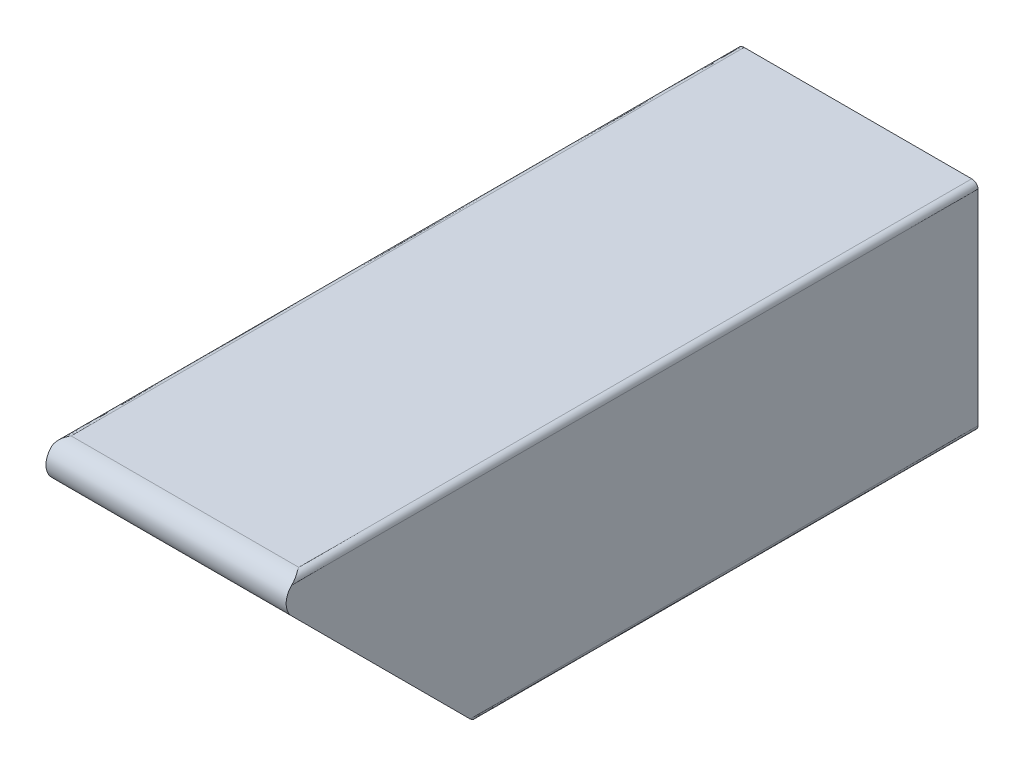
ISO-10303-21;
HEADER;
FILE_DESCRIPTION(('STEP AP214'),'2;1');
FILE_NAME('part.step','',(''),(''),'','','');
FILE_SCHEMA(('AUTOMOTIVE_DESIGN { 1 0 10303 214 1 1 1 1 }'));
ENDSEC;
DATA;
#1=APPLICATION_CONTEXT('core data for automotive mechanical design processes');
#2=APPLICATION_PROTOCOL_DEFINITION('international standard','automotive_design',2000,#1);
#3=PRODUCT_CONTEXT('',#1,'mechanical');
#4=PRODUCT('Part','Part','',(#3));
#5=PRODUCT_RELATED_PRODUCT_CATEGORY('part','',(#4));
#6=PRODUCT_DEFINITION_FORMATION('','',#4);
#7=PRODUCT_DEFINITION_CONTEXT('part definition',#1,'design');
#8=PRODUCT_DEFINITION('design','',#6,#7);
#9=PRODUCT_DEFINITION_SHAPE('','',#8);
#10=(LENGTH_UNIT() NAMED_UNIT(*) SI_UNIT(.MILLI.,.METRE.));
#11=(NAMED_UNIT(*) PLANE_ANGLE_UNIT() SI_UNIT($,.RADIAN.));
#12=(NAMED_UNIT(*) SI_UNIT($,.STERADIAN.) SOLID_ANGLE_UNIT());
#13=UNCERTAINTY_MEASURE_WITH_UNIT(LENGTH_MEASURE(1.E-05),#10,'distance_accuracy_value','');
#14=(GEOMETRIC_REPRESENTATION_CONTEXT(3) GLOBAL_UNCERTAINTY_ASSIGNED_CONTEXT((#13)) GLOBAL_UNIT_ASSIGNED_CONTEXT((#10,
#11,#12)) REPRESENTATION_CONTEXT('',''));
#15=CARTESIAN_POINT('',(0.,0.,0.));
#16=DIRECTION('',(0.,0.,1.));
#17=DIRECTION('',(1.,0.,0.));
#18=AXIS2_PLACEMENT_3D('',#15,#16,#17);
#19=CARTESIAN_POINT('',(-2.84195847499171,5.57,0.));
#20=CARTESIAN_POINT('',(-2.84195847499171,5.87,0.));
#21=CARTESIAN_POINT('',(-3.17500043299171,5.87,0.));
#22=CARTESIAN_POINT('',(-3.17500043299171,5.57,0.));
#23=CARTESIAN_POINT('',(-3.17500043299171,5.27,0.));
#24=CARTESIAN_POINT('',(-2.84195847499171,5.27,0.));
#25=CARTESIAN_POINT('',(-2.84195847499171,5.57,0.));
#26=(BOUNDED_CURVE() B_SPLINE_CURVE(3,(#19,#20,#21,#22,#23,#24,#25),.UNSPECIFIED.,.T.,
.F.) B_SPLINE_CURVE_WITH_KNOTS((4,3,4),(0.,0.5,1.),
.UNSPECIFIED.) CURVE() GEOMETRIC_REPRESENTATION_ITEM() RATIONAL_B_SPLINE_CURVE((1.,
0.333333333333333,0.333333333333333,1.,0.333333333333333,0.333333333333333,1.)) REPRESENTATION_ITEM(''));
#27=DIRECTION('',(0.,0.,1.));
#28=VECTOR('',#27,1.);
#29=SURFACE_OF_LINEAR_EXTRUSION('',#26,#28);
#30=DIRECTION('',(0.,0.,1.));
#31=VECTOR('',#30,1.);
#32=CARTESIAN_POINT('',(-3.00847945399171,5.72,0.));
#33=LINE('',#32,#31);
#34=CARTESIAN_POINT('',(-3.00847945399171,5.72,0.));
#35=VERTEX_POINT('',#34);
#36=CARTESIAN_POINT('',(-3.00847945399171,5.72,17.79289321881));
#37=VERTEX_POINT('',#36);
#38=EDGE_CURVE('E137',#35,#37,#33,.T.);
#39=ORIENTED_EDGE('',*,*,#38,.F.);
#40=CARTESIAN_POINT('',(-3.00847945399171,5.72,0.));
#41=CARTESIAN_POINT('',(-3.10602518507026,5.72,0.));
#42=CARTESIAN_POINT('',(-3.17500043299171,5.65786796564404,0.));
#43=CARTESIAN_POINT('',(-3.17500043299171,5.57,0.));
#44=(BOUNDED_CURVE() B_SPLINE_CURVE(3,(#40,#41,#42,#43),.UNSPECIFIED.,.F.,
.F.) B_SPLINE_CURVE_WITH_KNOTS((4,4),(0.,1.),
.UNSPECIFIED.) CURVE() GEOMETRIC_REPRESENTATION_ITEM() RATIONAL_B_SPLINE_CURVE((1.,
0.804737854124365,0.804737854124365,1.)) REPRESENTATION_ITEM(''));
#45=CARTESIAN_POINT('',(-3.17500043299171,5.57,0.));
#46=VERTEX_POINT('',#45);
#47=EDGE_CURVE('E135',#35,#46,#44,.T.);
#48=ORIENTED_EDGE('',*,*,#47,.T.);
#49=DIRECTION('',(0.,0.,1.));
#50=VECTOR('',#49,1.);
#51=CARTESIAN_POINT('',(-3.17500043299171,5.57,0.));
#52=LINE('',#51,#50);
#53=CARTESIAN_POINT('',(-3.17500043299171,5.57,18.14996464024));
#54=VERTEX_POINT('',#53);
#55=EDGE_CURVE('E11',#46,#54,#52,.T.);
#56=ORIENTED_EDGE('',*,*,#55,.T.);
#57=CARTESIAN_POINT('',(-3.17500043299171,5.57,18.14996464024));
#58=CARTESIAN_POINT('',(-3.17499862745097,5.57325314991682,18.146357391879));
#59=CARTESIAN_POINT('',(-3.17488282418564,5.57643203081947,18.142686482399));
#60=CARTESIAN_POINT('',(-3.17441917945536,5.58299635891492,18.1348503921439));
#61=CARTESIAN_POINT('',(-3.17404777046248,5.58636736416267,18.1306744447046));
#62=CARTESIAN_POINT('',(-3.17302752625531,5.59331063955079,18.1218295027796));
#63=CARTESIAN_POINT('',(-3.17235472858941,5.5968694795211,18.1171528522761));
#64=CARTESIAN_POINT('',(-3.1706793366588,5.60417224644487,18.1073028596466));
#65=CARTESIAN_POINT('',(-3.16965190825141,5.60790264778196,18.1021237409312));
#66=CARTESIAN_POINT('',(-3.16721230426873,5.61552443871989,18.0912674580455));
#67=CARTESIAN_POINT('',(-3.16577444686674,5.61940163339095,18.085586136188));
#68=CARTESIAN_POINT('',(-3.16245717589851,5.62728132580953,18.0737239843183));
#69=CARTESIAN_POINT('',(-3.16055130699932,5.63126823565474,18.0675402205765));
#70=CARTESIAN_POINT('',(-3.156242370209,5.63931857058958,18.0546721950702));
#71=CARTESIAN_POINT('',(-3.15381236769728,5.64336437984341,18.0479859486439));
#72=CARTESIAN_POINT('',(-3.14840452386978,5.65146879659182,18.0341124036215));
#73=CARTESIAN_POINT('',(-3.14539978171456,5.6555071970197,18.0269238166874));
#74=CARTESIAN_POINT('',(-3.13880125486425,5.66351786074037,18.0120446192704));
#75=CARTESIAN_POINT('',(-3.13518131050419,5.66746695757818,18.0043531077854));
#76=CARTESIAN_POINT('',(-3.12938243836477,5.67318024093566,17.9926245642263));
#77=CARTESIAN_POINT('',(-3.12733779542265,5.67508966146713,17.9885907415216));
#78=CARTESIAN_POINT('',(-3.12309091142364,5.6788521947167,17.9803973031705));
#79=CARTESIAN_POINT('',(-3.1208857694157,5.68070183341863,17.9762375896874));
#80=CARTESIAN_POINT('',(-3.11631848635312,5.6843309064639,17.9677925787227));
#81=CARTESIAN_POINT('',(-3.11395363696705,5.68610668719423,17.9635071784855));
#82=CARTESIAN_POINT('',(-3.10906921066446,5.68957380764901,17.954810758318));
#83=CARTESIAN_POINT('',(-3.10654714905366,5.69126133646724,17.9503996148654));
#84=CARTESIAN_POINT('',(-3.10135251501738,5.69453741942217,17.9414517498225));
#85=CARTESIAN_POINT('',(-3.09867771433626,5.69612202886507,17.9369148784957));
#86=CARTESIAN_POINT('',(-3.09318384925964,5.69917773390663,17.9277155849567));
#87=CARTESIAN_POINT('',(-3.09036284155328,5.70064478179833,17.9230529795752));
#88=CARTESIAN_POINT('',(-3.08458492430866,5.70345108078538,17.9136022547674));
#89=CARTESIAN_POINT('',(-3.08162638044113,5.70478621669916,17.9088139134154));
#90=CARTESIAN_POINT('',(-3.07558388694593,5.70731496661242,17.8991117544249));
#91=CARTESIAN_POINT('',(-3.07249862991545,5.70850443758609,17.8941976720493));
#92=CARTESIAN_POINT('',(-3.06621530334359,5.71072900038399,17.8842440697854));
#93=CARTESIAN_POINT('',(-3.06301626426597,5.71175996343614,17.8792042400191));
#94=CARTESIAN_POINT('',(-3.05651995853148,5.71365583696204,17.8689991807697));
#95=CARTESIAN_POINT('',(-3.05322206343766,5.71451667582651,17.8638335957328));
#96=CARTESIAN_POINT('',(-3.04654445733593,5.71606210761188,17.8533770597735));
#97=CARTESIAN_POINT('',(-3.04316445453416,5.71674272773716,17.8480857088653));
#98=CARTESIAN_POINT('',(-3.03634060953004,5.71791931443123,17.8373776749917));
#99=CARTESIAN_POINT('',(-3.03289679976672,5.71841144624887,17.8319605506421));
#100=CARTESIAN_POINT('',(-3.02596467693572,5.71920457313592,17.821000981547));
#101=CARTESIAN_POINT('',(-3.02247670331342,5.71950190416096,17.8154580580786));
#102=CARTESIAN_POINT('',(-3.01547623965094,5.71990145491796,17.8042469604541));
#103=CARTESIAN_POINT('',(-3.01196436710373,5.72000021512855,17.7985782768211));
#104=CARTESIAN_POINT('',(-3.00847945399171,5.72,17.79289321881));
#105=B_SPLINE_CURVE_WITH_KNOTS('',3,(#57,#58,#59,#60,#61,#62,#63,#64,#65,#66,#67,#68,#69,#70,
#71,#72,#73,#74,#75,#76,#77,#78,#79,#80,#81,#82,#83,#84,#85,#86,#87,#88,#89,#90,#91,#92,#93,#94,
#95,#96,#97,#98,#99,#100,#101,#102,#103,#104),.UNSPECIFIED.,.F.,.F.,(4,2,2,2,2,2,2,2,2,2,2,2,2,
2,2,2,2,2,2,2,2,2,2,4),(0.,0.0145666421575746,0.0306965033720033,0.0484341069619044,
0.0678197555207784,0.0888905845859748,0.11168063135536,0.136219952069652,0.162532769149774,
0.190634668193024,0.205359836027795,0.220532448091844,0.236150358896638,0.252210173879406,
0.268707159322137,0.285635182046729,0.302986687795451,0.320752726285511,0.338923029134572,
0.357486144191566,0.376429626388329,0.395740281285958,0.4154044533678,0.435408347247618),.UNSPECIFIED.);
#106=EDGE_CURVE('E112',#54,#37,#105,.T.);
#107=ORIENTED_EDGE('',*,*,#106,.T.);
#108=EDGE_LOOP('',(#39,#48,#56,#107));
#109=FACE_BOUND('',#108,.T.);
#110=ADVANCED_FACE('F44',(#109),#29,.T.);
#111=CARTESIAN_POINT('',(-3.17500043299171,5.57,0.));
#112=DIRECTION('',(-1.,0.,0.));
#113=DIRECTION('',(0.,0.,1.));
#114=AXIS2_PLACEMENT_3D('',#111,#112,#113);
#115=PLANE('',#114);
#116=ORIENTED_EDGE('',*,*,#55,.F.);
#117=DIRECTION('',(0.,-1.,0.));
#118=VECTOR('',#117,1.);
#119=CARTESIAN_POINT('',(-3.17500043299171,5.57,0.));
#120=LINE('',#119,#118);
#121=CARTESIAN_POINT('',(-3.17500043299171,0.15,0.));
#122=VERTEX_POINT('',#121);
#123=EDGE_CURVE('E130',#46,#122,#120,.T.);
#124=ORIENTED_EDGE('',*,*,#123,.T.);
#125=DIRECTION('',(0.,0.,1.));
#126=VECTOR('',#125,1.);
#127=CARTESIAN_POINT('',(-3.17500043299171,0.15,0.));
#128=LINE('',#127,#126);
#129=CARTESIAN_POINT('',(-3.17495370218495,0.1464466094067,13.42644660941));
#130=VERTEX_POINT('',#129);
#131=EDGE_CURVE('E122',#122,#130,#128,.T.);
#132=ORIENTED_EDGE('',*,*,#131,.T.);
#133=DIRECTION('',(0.,-0.707106781186548,-0.707106781186548));
#134=VECTOR('',#133,1.);
#135=CARTESIAN_POINT('',(-3.17500043299171,4.866446609407,18.14644660941));
#136=LINE('',#135,#134);
#137=CARTESIAN_POINT('',(-3.17500043299171,4.866446609407,18.14644660941));
#138=VERTEX_POINT('',#137);
#139=EDGE_CURVE('E64',#138,#130,#136,.T.);
#140=ORIENTED_EDGE('',*,*,#139,.F.);
#141=CARTESIAN_POINT('',(-3.17500043299171,5.22,17.79289321881));
#142=DIRECTION('',(1.,0.,0.));
#143=DIRECTION('',(0.,0.,-1.));
#144=AXIS2_PLACEMENT_3D('',#141,#142,#143);
#145=CIRCLE('',#144,0.500000000000003);
#146=EDGE_CURVE('E133',#54,#138,#145,.T.);
#147=ORIENTED_EDGE('',*,*,#146,.F.);
#148=EDGE_LOOP('',(#116,#124,#132,#140,#147));
#149=FACE_BOUND('',#148,.T.);
#150=ADVANCED_FACE('F128',(#149),#115,.T.);
#151=CARTESIAN_POINT('',(-3.00847945399171,0.,0.));
#152=DIRECTION('',(0.,-1.,0.));
#153=DIRECTION('',(0.,0.,-1.));
#154=AXIS2_PLACEMENT_3D('',#151,#152,#153);
#155=PLANE('',#154);
#156=DIRECTION('',(0.,0.,1.));
#157=VECTOR('',#156,1.);
#158=CARTESIAN_POINT('',(-3.00847945399171,0.,0.));
#159=LINE('',#158,#157);
#160=CARTESIAN_POINT('',(-3.00847945399171,0.,0.));
#161=VERTEX_POINT('',#160);
#162=CARTESIAN_POINT('',(-3.00847945399171,0.,13.07289321881));
#163=VERTEX_POINT('',#162);
#164=EDGE_CURVE('E55',#161,#163,#159,.T.);
#165=ORIENTED_EDGE('',*,*,#164,.F.);
#166=DIRECTION('',(1.,0.,0.));
#167=VECTOR('',#166,1.);
#168=CARTESIAN_POINT('',(-3.00847945399171,0.,0.));
#169=LINE('',#168,#167);
#170=CARTESIAN_POINT('',(3.00847858720829,0.,0.));
#171=VERTEX_POINT('',#170);
#172=EDGE_CURVE('E153',#161,#171,#169,.T.);
#173=ORIENTED_EDGE('',*,*,#172,.T.);
#174=DIRECTION('',(0.,0.,1.));
#175=VECTOR('',#174,1.);
#176=CARTESIAN_POINT('',(3.00847858720829,0.,0.));
#177=LINE('',#176,#175);
#178=CARTESIAN_POINT('',(3.00847858720829,0.,13.07289321881));
#179=VERTEX_POINT('',#178);
#180=EDGE_CURVE('E337',#171,#179,#177,.T.);
#181=ORIENTED_EDGE('',*,*,#180,.T.);
#182=DIRECTION('',(1.,0.,0.));
#183=VECTOR('',#182,1.);
#184=CARTESIAN_POINT('',(-3.00847945399171,0.,13.07289321881));
#185=LINE('',#184,#183);
#186=EDGE_CURVE('E358',#163,#179,#185,.T.);
#187=ORIENTED_EDGE('',*,*,#186,.F.);
#188=EDGE_LOOP('',(#165,#173,#181,#187));
#189=FACE_BOUND('',#188,.T.);
#190=ADVANCED_FACE('F187',(#189),#155,.T.);
#191=CARTESIAN_POINT('',(-2.84195847499171,0.15,0.));
#192=CARTESIAN_POINT('',(-2.84195847499171,0.45,0.));
#193=CARTESIAN_POINT('',(-3.17500043299171,0.45,0.));
#194=CARTESIAN_POINT('',(-3.17500043299171,0.15,0.));
#195=CARTESIAN_POINT('',(-3.17500043299171,-0.15,0.));
#196=CARTESIAN_POINT('',(-2.84195847499171,-0.15,0.));
#197=CARTESIAN_POINT('',(-2.84195847499171,0.15,0.));
#198=(BOUNDED_CURVE() B_SPLINE_CURVE(3,(#191,#192,#193,#194,#195,#196,#197),.UNSPECIFIED.,.T.,
.F.) B_SPLINE_CURVE_WITH_KNOTS((4,3,4),(0.,0.5,1.),
.UNSPECIFIED.) CURVE() GEOMETRIC_REPRESENTATION_ITEM() RATIONAL_B_SPLINE_CURVE((1.,
0.333333333333333,0.333333333333333,1.,0.333333333333333,0.333333333333333,1.)) REPRESENTATION_ITEM(''));
#199=DIRECTION('',(0.,0.,1.));
#200=VECTOR('',#199,1.);
#201=SURFACE_OF_LINEAR_EXTRUSION('',#198,#200);
#202=CARTESIAN_POINT('',(-3.00847945399171,0.,13.07289321881));
#203=CARTESIAN_POINT('',(-3.01194944272304,-2.12078318790988E-07,13.0785429327722));
#204=CARTESIAN_POINT('',(-3.0154449096805,9.77023975147779E-05,13.0841771395099));
#205=CARTESIAN_POINT('',(-3.02240868938693,0.000493299438635442,13.0953191611006));
#206=CARTESIAN_POINT('',(-3.02587641479141,0.000787473084814518,13.1008274682234));
#207=CARTESIAN_POINT('',(-3.03276461086166,0.00157138969136472,13.1117176899731));
#208=CARTESIAN_POINT('',(-3.03618477529502,0.00205743025301691,13.1171000637268));
#209=CARTESIAN_POINT('',(-3.04295848459725,0.00321839887637884,13.1277384815051));
#210=CARTESIAN_POINT('',(-3.04631203057034,0.00388946673736666,13.1329949454903));
#211=CARTESIAN_POINT('',(-3.05293455080314,0.00541192432341553,13.1433815936664));
#212=CARTESIAN_POINT('',(-3.05620384802753,0.00625932983615945,13.1485121551572));
#213=CARTESIAN_POINT('',(-3.06264152681588,0.00812415322956434,13.1586470529941));
#214=CARTESIAN_POINT('',(-3.06581056264199,0.00913750248981244,13.1636517216323));
#215=CARTESIAN_POINT('',(-3.07203322949912,0.0113224674342699,13.1735348867776));
#216=CARTESIAN_POINT('',(-3.07508784766353,0.0124899712987167,13.1784136700178));
#217=CARTESIAN_POINT('',(-3.08106919574608,0.0149703565190709,13.1880451131257));
#218=CARTESIAN_POINT('',(-3.0839972398401,0.0162791245822433,13.1927980154157));
#219=CARTESIAN_POINT('',(-3.08971505834387,0.019028322263456,13.2021777467308));
#220=CARTESIAN_POINT('',(-3.09250646081873,0.0204646772870443,13.2068047766669));
#221=CARTESIAN_POINT('',(-3.09794273243064,0.023454798105024,13.2159327859545));
#222=CARTESIAN_POINT('',(-3.10058952421611,0.0250045655237463,13.2204339297588));
#223=CARTESIAN_POINT('',(-3.10573044021112,0.0282070675966754,13.2293102593447));
#224=CARTESIAN_POINT('',(-3.10822675587899,0.0298559119917289,13.2336855769395));
#225=CARTESIAN_POINT('',(-3.11306248335464,0.0332420210716107,13.2423100626449));
#226=CARTESIAN_POINT('',(-3.11540432964893,0.0349755350881934,13.2465593443616));
#227=CARTESIAN_POINT('',(-3.12209141247752,0.0402096118181162,13.2589336993872));
#228=CARTESIAN_POINT('',(-3.12631363265064,0.043878473417415,13.2670552647253));
#229=CARTESIAN_POINT('',(-3.13411137328998,0.05142002934569,13.2827942205449));
#230=CARTESIAN_POINT('',(-3.13771058898799,0.0552668462640475,13.2904123003478));
#231=CARTESIAN_POINT('',(-3.14428590354577,0.06306830714555,13.3051447438512));
#232=CARTESIAN_POINT('',(-3.1472872030439,0.0670000560989954,13.3122599544713));
#233=CARTESIAN_POINT('',(-3.15270592044309,0.0748900453355242,13.32598599026));
#234=CARTESIAN_POINT('',(-3.15514919373993,0.0788282093349038,13.3325981348134));
#235=CARTESIAN_POINT('',(-3.15950150367055,0.0866655720940462,13.3453173821924));
#236=CARTESIAN_POINT('',(-3.16143636069962,0.0905470991325357,13.3514265183213));
#237=CARTESIAN_POINT('',(-3.16482667189701,0.0982210251959855,13.3631387668998));
#238=CARTESIAN_POINT('',(-3.16630745177044,0.101997596441557,13.368744897021));
#239=CARTESIAN_POINT('',(-3.16884584468519,0.109425145843874,13.3794501419823));
#240=CARTESIAN_POINT('',(-3.16992802289472,0.113061508205031,13.3845535343679));
#241=CARTESIAN_POINT('',(-3.1717235992312,0.120184593842644,13.3942513558615));
#242=CARTESIAN_POINT('',(-3.17246074657529,0.123657192478676,13.3988517342334));
#243=CARTESIAN_POINT('',(-3.1736181526168,0.130437126039481,13.4075434424189));
#244=CARTESIAN_POINT('',(-3.17406132812569,0.133730267214624,13.4116426628685));
#245=CARTESIAN_POINT('',(-3.17467496722192,0.1401486453217,13.4193242848978));
#246=CARTESIAN_POINT('',(-3.17486799153346,0.143258474093112,13.4229178239839));
#247=CARTESIAN_POINT('',(-3.17495370218474,0.146446609406705,13.42644660941));
#248=B_SPLINE_CURVE_WITH_KNOTS('',3,(#202,#203,#204,#205,#206,#207,#208,#209,#210,#211,#212,
#213,#214,#215,#216,#217,#218,#219,#220,#221,#222,#223,#224,#225,#226,#227,#228,#229,#230,#231,
#232,#233,#234,#235,#236,#237,#238,#239,#240,#241,#242,#243,#244,#245,#246,#247),.UNSPECIFIED.,
.F.,.F.,(4,2,2,2,2,2,2,2,2,2,2,2,2,2,2,2,2,2,2,2,2,2,4),(0.,0.0198901049183658,
0.0394337980003904,0.0586174773289835,0.0774278062092118,0.0958520167549782,0.113878176277606,
0.13149540645306,0.148694049160093,0.16546577684869,0.181803648939331,0.197702118782506,
0.213156997949304,0.242722325792192,0.270493635771057,0.296476620079555,0.320688392987399,
0.343154088617531,0.363904259387206,0.38297320754423,0.400398262263754,0.416219993603022,
0.430483420981324),.UNSPECIFIED.);
#249=EDGE_CURVE('E168',#163,#130,#248,.T.);
#250=ORIENTED_EDGE('',*,*,#249,.T.);
#251=ORIENTED_EDGE('',*,*,#131,.F.);
#252=CARTESIAN_POINT('',(-3.17500043299171,0.15,0.));
#253=CARTESIAN_POINT('',(-3.17500043299171,0.0621320343559642,0.));
#254=CARTESIAN_POINT('',(-3.10602518507026,0.,0.));
#255=CARTESIAN_POINT('',(-3.00847945399171,0.,0.));
#256=(BOUNDED_CURVE() B_SPLINE_CURVE(3,(#252,#253,#254,#255),.UNSPECIFIED.,.F.,
.F.) B_SPLINE_CURVE_WITH_KNOTS((4,4),(0.,1.),
.UNSPECIFIED.) CURVE() GEOMETRIC_REPRESENTATION_ITEM() RATIONAL_B_SPLINE_CURVE((1.,
0.804737854124365,0.804737854124365,1.)) REPRESENTATION_ITEM(''));
#257=EDGE_CURVE('E146',#122,#161,#256,.T.);
#258=ORIENTED_EDGE('',*,*,#257,.T.);
#259=ORIENTED_EDGE('',*,*,#164,.T.);
#260=EDGE_LOOP('',(#250,#251,#258,#259));
#261=FACE_BOUND('',#260,.T.);
#262=ADVANCED_FACE('F177',(#261),#201,.T.);
#263=CARTESIAN_POINT('',(-4.82910882439171,0.,13.28));
#264=DIRECTION('',(0.,0.707106781186548,-0.707106781186548));
#265=DIRECTION('',(-1.,0.,0.));
#266=AXIS2_PLACEMENT_3D('',#263,#264,#265);
#267=PLANE('',#266);
#268=ORIENTED_EDGE('',*,*,#139,.T.);
#269=DIRECTION('',(1.,0.,0.));
#270=VECTOR('',#269,1.);
#271=CARTESIAN_POINT('',(-3.17495370218495,0.1464466094067,13.42644660941));
#272=LINE('',#271,#270);
#273=CARTESIAN_POINT('',(3.17495283540153,0.1464466094067,13.42644660941));
#274=VERTEX_POINT('',#273);
#275=EDGE_CURVE('E325',#130,#274,#272,.T.);
#276=ORIENTED_EDGE('',*,*,#275,.T.);
#277=DIRECTION('',(0.,0.707106781186548,0.707106781186548));
#278=VECTOR('',#277,1.);
#279=CARTESIAN_POINT('',(3.17499956620829,0.15,13.43));
#280=LINE('',#279,#278);
#281=CARTESIAN_POINT('',(3.17499956620829,4.866446609407,18.14644660941));
#282=VERTEX_POINT('',#281);
#283=EDGE_CURVE('E314',#274,#282,#280,.T.);
#284=ORIENTED_EDGE('',*,*,#283,.T.);
#285=DIRECTION('',(-1.,0.,0.));
#286=VECTOR('',#285,1.);
#287=CARTESIAN_POINT('',(3.17499956620829,4.866446609407,18.14644660941));
#288=LINE('',#287,#286);
#289=EDGE_CURVE('E211',#282,#138,#288,.T.);
#290=ORIENTED_EDGE('',*,*,#289,.T.);
#291=EDGE_LOOP('',(#268,#276,#284,#290));
#292=FACE_BOUND('',#291,.T.);
#293=ADVANCED_FACE('F186',(#292),#267,.F.);
#294=CARTESIAN_POINT('',(3.17499956620829,0.5,13.07289321881));
#295=DIRECTION('',(1.,0.,0.));
#296=DIRECTION('',(0.,1.,0.));
#297=AXIS2_PLACEMENT_3D('',#294,#295,#296);
#298=CYLINDRICAL_SURFACE('',#297,0.5);
#299=ORIENTED_EDGE('',*,*,#249,.F.);
#300=ORIENTED_EDGE('',*,*,#186,.T.);
#301=CARTESIAN_POINT('',(3.17495283540132,0.146446609406704,13.42644660941));
#302=CARTESIAN_POINT('',(3.17486712208981,0.14325835320795,13.422917462407));
#303=CARTESIAN_POINT('',(3.17467408514818,0.140148387828344,13.4193235789311));
#304=CARTESIAN_POINT('',(3.17406040092783,0.13372974513118,13.4116413107918));
#305=CARTESIAN_POINT('',(3.17361719369499,0.130436471314702,13.4075417930211));
#306=CARTESIAN_POINT('',(3.17245970344919,0.123656285501075,13.3988495322882));
#307=CARTESIAN_POINT('',(3.17172250421772,0.120183563739687,13.3942489015938));
#308=CARTESIAN_POINT('',(3.16992680411833,0.113060248489168,13.3845506192397));
#309=CARTESIAN_POINT('',(3.16884455468367,0.109423776872173,13.3794470204691));
#310=CARTESIAN_POINT('',(3.16630600123485,0.101996030399014,13.3687414070513));
#311=CARTESIAN_POINT('',(3.164825132839,0.0982193692276463,13.3631351163665));
#312=CARTESIAN_POINT('',(3.16143463028969,0.0905452897504479,13.3514225915978));
#313=CARTESIAN_POINT('',(3.159499671476,0.0866636975805369,13.3453133408878));
#314=CARTESIAN_POINT('',(3.15514714960205,0.0788262359014477,13.3325939096923));
#315=CARTESIAN_POINT('',(3.1527037675475,0.0748880367621258,13.3259816965743));
#316=CARTESIAN_POINT('',(3.14728483262103,0.0669980126059757,13.3122555693469));
#317=CARTESIAN_POINT('',(3.14428342618825,0.0630662626104399,13.3051403362199));
#318=CARTESIAN_POINT('',(3.13770790849706,0.055264837228335,13.2904078936589));
#319=CARTESIAN_POINT('',(3.13410859890058,0.0514180554553656,13.2827898374192));
#320=CARTESIAN_POINT('',(3.12631069387665,0.0438766068022424,13.2670509748763));
#321=CARTESIAN_POINT('',(3.1220884059496,0.0402078155732511,13.2589294791663));
#322=CARTESIAN_POINT('',(3.11540124094486,0.0349738595278556,13.2465552439168));
#323=CARTESIAN_POINT('',(3.1130593751044,0.0332403923808958,13.2423060141511));
#324=CARTESIAN_POINT('',(3.10822361980861,0.0298543838635118,13.2336816439158));
#325=CARTESIAN_POINT('',(3.10572729625465,0.0282055928240251,13.2293063898059));
#326=CARTESIAN_POINT('',(3.10058637733051,0.0250032029801756,13.220430198754));
#327=CARTESIAN_POINT('',(3.0979395908904,0.0234534940500726,13.2159291299603));
#328=CARTESIAN_POINT('',(3.09250334420008,0.0204634941205772,13.20680128226));
#329=CARTESIAN_POINT('',(3.08971196168103,0.0190272010631306,13.2021743388612));
#330=CARTESIAN_POINT('',(3.08399419845866,0.0162781293428696,13.1927947921833));
#331=CARTESIAN_POINT('',(3.08106619005072,0.0149694247926938,13.1880419879557));
#332=CARTESIAN_POINT('',(3.07508492952798,0.0124891664994015,13.1784107525296));
#333=CARTESIAN_POINT('',(3.0720303635683,0.0113217255223476,13.173532078876));
#334=CARTESIAN_POINT('',(3.06580781774044,0.00913688393022673,13.1636491444533));
#335=CARTESIAN_POINT('',(3.06263885103041,0.00812359456903562,13.1586445969252));
#336=CARTESIAN_POINT('',(3.05620132708543,0.00625888609579583,13.1485099528487));
#337=CARTESIAN_POINT('',(3.05293211583154,0.00541153500698445,13.1433795239914));
#338=CARTESIAN_POINT('',(3.04630978366173,0.00388917887925133,13.1329931526118));
#339=CARTESIAN_POINT('',(3.04295633996883,0.00321815743395608,13.1277368327837));
#340=CARTESIAN_POINT('',(3.03618285035783,0.0020572717762206,13.1170987148385));
#341=CARTESIAN_POINT('',(3.03276280346275,0.00157126713555015,13.1117164967666));
#342=CARTESIAN_POINT('',(3.02587485610889,0.000787410139553582,13.1008265978881));
#343=CARTESIAN_POINT('',(3.02240726194668,0.000493259555085415,13.0953184579727));
#344=CARTESIAN_POINT('',(3.01544375639667,9.76943125874671E-05,13.0841767822972));
#345=CARTESIAN_POINT('',(3.0119484323549,-2.12039898597423E-07,13.0785427542974));
#346=CARTESIAN_POINT('',(3.00847858720829,0.,13.07289321881));
#347=B_SPLINE_CURVE_WITH_KNOTS('',3,(#301,#302,#303,#304,#305,#306,#307,#308,#309,#310,#311,
#312,#313,#314,#315,#316,#317,#318,#319,#320,#321,#322,#323,#324,#325,#326,#327,#328,#329,#330,
#331,#332,#333,#334,#335,#336,#337,#338,#339,#340,#341,#342,#343,#344,#345,#346),.UNSPECIFIED.,
.F.,.F.,(4,2,2,2,2,2,2,2,2,2,2,2,2,2,2,2,2,2,2,2,2,2,4),(0.,0.0142644774724175,
0.0300871590480496,0.0475130533583094,0.0665827219426245,0.087333486486415,0.10979964190131,
0.13401173279146,0.15999488457957,0.187766201808264,0.217331366145827,0.232786096152422,
0.248684370194425,0.265021998696404,0.281793434031346,0.298991734867295,0.316608573181338,
0.334634290707503,0.353058009343443,0.371867797012135,0.391050886834225,0.410593943500989,
0.430483366823745),.UNSPECIFIED.);
#348=EDGE_CURVE('E345',#274,#179,#347,.T.);
#349=ORIENTED_EDGE('',*,*,#348,.F.);
#350=ORIENTED_EDGE('',*,*,#275,.F.);
#351=EDGE_LOOP('',(#299,#300,#349,#350));
#352=FACE_BOUND('',#351,.T.);
#353=ADVANCED_FACE('F191',(#352),#298,.T.);
#354=CARTESIAN_POINT('',(3.17499956620829,0.15,0.));
#355=CARTESIAN_POINT('',(3.17499956620829,0.45,0.));
#356=CARTESIAN_POINT('',(2.84195760820829,0.45,0.));
#357=CARTESIAN_POINT('',(2.84195760820829,0.15,0.));
#358=CARTESIAN_POINT('',(2.84195760820829,-0.15,0.));
#359=CARTESIAN_POINT('',(3.17499956620829,-0.15,0.));
#360=CARTESIAN_POINT('',(3.17499956620829,0.15,0.));
#361=(BOUNDED_CURVE() B_SPLINE_CURVE(3,(#354,#355,#356,#357,#358,#359,#360),.UNSPECIFIED.,.T.,
.F.) B_SPLINE_CURVE_WITH_KNOTS((4,3,4),(0.,0.5,1.),
.UNSPECIFIED.) CURVE() GEOMETRIC_REPRESENTATION_ITEM() RATIONAL_B_SPLINE_CURVE((1.,
0.333333333333333,0.333333333333333,1.,0.333333333333333,0.333333333333333,1.)) REPRESENTATION_ITEM(''));
#362=DIRECTION('',(0.,0.,1.));
#363=VECTOR('',#362,1.);
#364=SURFACE_OF_LINEAR_EXTRUSION('',#361,#363);
#365=ORIENTED_EDGE('',*,*,#180,.F.);
#366=CARTESIAN_POINT('',(3.00847858720829,0.,0.));
#367=CARTESIAN_POINT('',(3.10602431828685,0.,0.));
#368=CARTESIAN_POINT('',(3.17499956620829,0.0621320343559642,0.));
#369=CARTESIAN_POINT('',(3.17499956620829,0.15,0.));
#370=(BOUNDED_CURVE() B_SPLINE_CURVE(3,(#366,#367,#368,#369),.UNSPECIFIED.,.F.,
.F.) B_SPLINE_CURVE_WITH_KNOTS((4,4),(0.,1.),
.UNSPECIFIED.) CURVE() GEOMETRIC_REPRESENTATION_ITEM() RATIONAL_B_SPLINE_CURVE((1.,
0.804737854124365,0.804737854124365,1.)) REPRESENTATION_ITEM(''));
#371=CARTESIAN_POINT('',(3.17499956620829,0.15,0.));
#372=VERTEX_POINT('',#371);
#373=EDGE_CURVE('E220',#171,#372,#370,.T.);
#374=ORIENTED_EDGE('',*,*,#373,.T.);
#375=DIRECTION('',(0.,0.,1.));
#376=VECTOR('',#375,1.);
#377=CARTESIAN_POINT('',(3.17499956620829,0.15,0.));
#378=LINE('',#377,#376);
#379=EDGE_CURVE('E333',#372,#274,#378,.T.);
#380=ORIENTED_EDGE('',*,*,#379,.T.);
#381=ORIENTED_EDGE('',*,*,#348,.T.);
#382=EDGE_LOOP('',(#365,#374,#380,#381));
#383=FACE_BOUND('',#382,.T.);
#384=ADVANCED_FACE('F195',(#383),#364,.T.);
#385=CARTESIAN_POINT('',(3.17499956620829,0.15,0.));
#386=DIRECTION('',(1.,0.,0.));
#387=DIRECTION('',(0.,1.,0.));
#388=AXIS2_PLACEMENT_3D('',#385,#386,#387);
#389=PLANE('',#388);
#390=ORIENTED_EDGE('',*,*,#283,.F.);
#391=ORIENTED_EDGE('',*,*,#379,.F.);
#392=DIRECTION('',(0.,1.,0.));
#393=VECTOR('',#392,1.);
#394=CARTESIAN_POINT('',(3.17499956620829,0.15,0.));
#395=LINE('',#394,#393);
#396=CARTESIAN_POINT('',(3.17499956620829,5.57,0.));
#397=VERTEX_POINT('',#396);
#398=EDGE_CURVE('E226',#372,#397,#395,.T.);
#399=ORIENTED_EDGE('',*,*,#398,.T.);
#400=DIRECTION('',(0.,0.,1.));
#401=VECTOR('',#400,1.);
#402=CARTESIAN_POINT('',(3.17499956620829,5.57,0.));
#403=LINE('',#402,#401);
#404=CARTESIAN_POINT('',(3.17499956620829,5.57,18.14996464024));
#405=VERTEX_POINT('',#404);
#406=EDGE_CURVE('E292',#397,#405,#403,.T.);
#407=ORIENTED_EDGE('',*,*,#406,.T.);
#408=CARTESIAN_POINT('',(3.17499956620829,5.22,17.79289321881));
#409=DIRECTION('',(1.,0.,0.));
#410=DIRECTION('',(0.,0.,-1.));
#411=AXIS2_PLACEMENT_3D('',#408,#409,#410);
#412=CIRCLE('',#411,0.500000000000003);
#413=EDGE_CURVE('E219',#405,#282,#412,.T.);
#414=ORIENTED_EDGE('',*,*,#413,.T.);
#415=EDGE_LOOP('',(#390,#391,#399,#407,#414));
#416=FACE_BOUND('',#415,.T.);
#417=ADVANCED_FACE('F260',(#416),#389,.T.);
#418=CARTESIAN_POINT('',(3.17499956620829,5.22,17.79289321881));
#419=DIRECTION('',(1.,0.,0.));
#420=DIRECTION('',(0.,1.,0.));
#421=AXIS2_PLACEMENT_3D('',#418,#419,#420);
#422=CYLINDRICAL_SURFACE('',#421,0.5);
#423=ORIENTED_EDGE('',*,*,#106,.F.);
#424=ORIENTED_EDGE('',*,*,#146,.T.);
#425=ORIENTED_EDGE('',*,*,#289,.F.);
#426=ORIENTED_EDGE('',*,*,#413,.F.);
#427=CARTESIAN_POINT('',(3.00847858720829,5.72,17.79289321881));
#428=CARTESIAN_POINT('',(3.01196482895453,5.7200002154811,17.7985799922239));
#429=CARTESIAN_POINT('',(3.01547802454997,5.71990137976705,17.8042503934334));
#430=CARTESIAN_POINT('',(3.02248102605738,5.71950153310784,17.8154648150752));
#431=CARTESIAN_POINT('',(3.02597021440118,5.71920398744678,17.8210093453182));
#432=CARTESIAN_POINT('',(3.03290463875117,5.71841030542429,17.8319720169812));
#433=CARTESIAN_POINT('',(3.03634953582263,5.71791783902296,17.8373906373487));
#434=CARTESIAN_POINT('',(3.04317541221837,5.71674047919985,17.8481015523987));
#435=CARTESIAN_POINT('',(3.04655636020999,5.71605942647548,17.8533942885774));
#436=CARTESIAN_POINT('',(3.05323570287025,5.71451304877387,17.8638534843395));
#437=CARTESIAN_POINT('',(3.05653439101437,5.71365170246209,17.8690203439108));
#438=CARTESIAN_POINT('',(3.0630321232288,5.71175475719643,17.8792278415951));
#439=CARTESIAN_POINT('',(3.06623179795022,5.71072323553788,17.8842688351632));
#440=CARTESIAN_POINT('',(3.07251623506084,5.70849752228777,17.8942246544818));
#441=CARTESIAN_POINT('',(3.07560196966845,5.70730746487587,17.8991397899253));
#442=CARTESIAN_POINT('',(3.08164526079222,5.70477753142022,17.9088439445639));
#443=CARTESIAN_POINT('',(3.08460412777994,5.70344180345345,17.9136332282446));
#444=CARTESIAN_POINT('',(3.09038254083344,5.70063433056938,17.9230857272569));
#445=CARTESIAN_POINT('',(3.0932037245909,5.69916670547156,17.9277491642194));
#446=CARTESIAN_POINT('',(3.09869780170606,5.69610987487678,17.9369500104747));
#447=CARTESIAN_POINT('',(3.10137264193247,5.69452472127761,17.9414876026238));
#448=CARTESIAN_POINT('',(3.10656722796691,5.69124759492033,17.9504367988482));
#449=CARTESIAN_POINT('',(3.10908920568633,5.68955957058917,17.9548485523543));
#450=CARTESIAN_POINT('',(3.11397335199326,5.68609151723587,17.9635460821176));
#451=CARTESIAN_POINT('',(3.1163380089374,5.68431530240648,17.9678319816244));
#452=CARTESIAN_POINT('',(3.12090481099541,5.68068542962623,17.9762778805643));
#453=CARTESIAN_POINT('',(3.12310966802801,5.67883542815852,17.9804379825346));
#454=CARTESIAN_POINT('',(3.12735590265974,5.67507224520048,17.9886320871704));
#455=CARTESIAN_POINT('',(3.1294001846557,5.67316254022511,17.992666187538));
#456=CARTESIAN_POINT('',(3.13519781981717,5.66744861324996,18.0043952295539));
#457=CARTESIAN_POINT('',(3.13881687471697,5.66349920105003,18.0120869675886));
#458=CARTESIAN_POINT('',(3.14541348607704,5.65548823214192,18.0269661739274));
#459=CARTESIAN_POINT('',(3.14841722429035,5.65144985580645,18.0341545448053));
#460=CARTESIAN_POINT('',(3.1538230339242,5.64334579210969,18.0480272111335));
#461=CARTESIAN_POINT('',(3.15625202397658,5.63930032449326,18.0547127988796));
#462=CARTESIAN_POINT('',(3.16055899599973,5.63125093599896,18.0675790579727));
#463=CARTESIAN_POINT('',(3.16246392643954,5.62726464446946,18.073761720844));
#464=CARTESIAN_POINT('',(3.1657794418973,5.61938639811021,18.0856212186758));
#465=CARTESIAN_POINT('',(3.16721649293033,5.61551004743988,18.0913009977828));
#466=CARTESIAN_POINT('',(3.16965464407169,5.60789009643709,18.1021537399892));
#467=CARTESIAN_POINT('',(3.17068143449978,5.604160711652,18.1073308755697));
#468=CARTESIAN_POINT('',(3.17235572841659,5.59686007122493,18.1171764396387));
#469=CARTESIAN_POINT('',(3.1730280735637,5.59330236788862,18.1218506655659));
#470=CARTESIAN_POINT('',(3.17404759661752,5.58636141051395,18.1306902976313));
#471=CARTESIAN_POINT('',(3.1744187442857,5.58299162019224,18.1348633876701));
#472=CARTESIAN_POINT('',(3.17488203527939,5.57642970469762,18.1426932695076));
#473=CARTESIAN_POINT('',(3.17499775554976,5.57325206536441,18.1463608696201));
#474=CARTESIAN_POINT('',(3.17499956620829,5.57,18.14996464024));
#475=B_SPLINE_CURVE_WITH_KNOTS('',3,(#427,#428,#429,#430,#431,#432,#433,#434,#435,#436,#437,
#438,#439,#440,#441,#442,#443,#444,#445,#446,#447,#448,#449,#450,#451,#452,#453,#454,#455,#456,
#457,#458,#459,#460,#461,#462,#463,#464,#465,#466,#467,#468,#469,#470,#471,#472,#473,#474),
.UNSPECIFIED.,.F.,.F.,(4,2,2,2,2,2,2,2,2,2,2,2,2,2,2,2,2,2,2,2,2,2,2,4),(0.,0.0200103637171067,
0.0396805764022377,0.0589968265029223,0.0779454454638872,0.0965132293181644,0.114687727160791,
0.132457484676881,0.149812234796002,0.166743031679247,0.183242328195114,0.199304000461886,
0.214923325694973,0.23009692138451,0.244822654741098,0.27292448268704,0.29923570920565,
0.323772012956781,0.346557699497148,0.367622899635571,0.387001720523379,0.40473136903737,
0.420852228694326,0.435408924775222),.UNSPECIFIED.);
#476=CARTESIAN_POINT('',(3.00847858720829,5.72,17.79289321881));
#477=VERTEX_POINT('',#476);
#478=EDGE_CURVE('E103',#477,#405,#475,.T.);
#479=ORIENTED_EDGE('',*,*,#478,.F.);
#480=DIRECTION('',(1.,0.,0.));
#481=VECTOR('',#480,1.);
#482=CARTESIAN_POINT('',(-3.00847945399171,5.72,17.79289321881));
#483=LINE('',#482,#481);
#484=EDGE_CURVE('E284',#37,#477,#483,.T.);
#485=ORIENTED_EDGE('',*,*,#484,.F.);
#486=EDGE_LOOP('',(#423,#424,#425,#426,#479,#485));
#487=FACE_BOUND('',#486,.T.);
#488=ADVANCED_FACE('F188',(#487),#422,.T.);
#489=CARTESIAN_POINT('',(3.17499956620829,5.57,0.));
#490=CARTESIAN_POINT('',(3.17499956620829,5.87,0.));
#491=CARTESIAN_POINT('',(2.84195760820829,5.87,0.));
#492=CARTESIAN_POINT('',(2.84195760820829,5.57,0.));
#493=CARTESIAN_POINT('',(2.84195760820829,5.27,0.));
#494=CARTESIAN_POINT('',(3.17499956620829,5.27,0.));
#495=CARTESIAN_POINT('',(3.17499956620829,5.57,0.));
#496=(BOUNDED_CURVE() B_SPLINE_CURVE(3,(#489,#490,#491,#492,#493,#494,#495),.UNSPECIFIED.,.T.,
.F.) B_SPLINE_CURVE_WITH_KNOTS((4,3,4),(0.,0.5,1.),
.UNSPECIFIED.) CURVE() GEOMETRIC_REPRESENTATION_ITEM() RATIONAL_B_SPLINE_CURVE((1.,
0.333333333333333,0.333333333333333,1.,0.333333333333333,0.333333333333333,1.)) REPRESENTATION_ITEM(''));
#497=DIRECTION('',(0.,0.,1.));
#498=VECTOR('',#497,1.);
#499=SURFACE_OF_LINEAR_EXTRUSION('',#496,#498);
#500=ORIENTED_EDGE('',*,*,#406,.F.);
#501=CARTESIAN_POINT('',(3.17499956620829,5.57,0.));
#502=CARTESIAN_POINT('',(3.17499956620829,5.65786796564404,0.));
#503=CARTESIAN_POINT('',(3.10602431828685,5.72,0.));
#504=CARTESIAN_POINT('',(3.00847858720829,5.72,0.));
#505=(BOUNDED_CURVE() B_SPLINE_CURVE(3,(#501,#502,#503,#504),.UNSPECIFIED.,.F.,
.F.) B_SPLINE_CURVE_WITH_KNOTS((4,4),(0.,1.),
.UNSPECIFIED.) CURVE() GEOMETRIC_REPRESENTATION_ITEM() RATIONAL_B_SPLINE_CURVE((1.,
0.804737854124365,0.804737854124365,1.)) REPRESENTATION_ITEM(''));
#506=CARTESIAN_POINT('',(3.00847858720829,5.72,0.));
#507=VERTEX_POINT('',#506);
#508=EDGE_CURVE('E233',#397,#507,#505,.T.);
#509=ORIENTED_EDGE('',*,*,#508,.T.);
#510=DIRECTION('',(0.,0.,1.));
#511=VECTOR('',#510,1.);
#512=CARTESIAN_POINT('',(3.00847858720829,5.72,0.));
#513=LINE('',#512,#511);
#514=EDGE_CURVE('E298',#507,#477,#513,.T.);
#515=ORIENTED_EDGE('',*,*,#514,.T.);
#516=ORIENTED_EDGE('',*,*,#478,.T.);
#517=EDGE_LOOP('',(#500,#509,#515,#516));
#518=FACE_BOUND('',#517,.T.);
#519=ADVANCED_FACE('F243',(#518),#499,.T.);
#520=CARTESIAN_POINT('',(-1.77622420939171,5.72,0.));
#521=DIRECTION('',(0.,1.,0.));
#522=DIRECTION('',(1.,0.,0.));
#523=AXIS2_PLACEMENT_3D('',#520,#521,#522);
#524=PLANE('',#523);
#525=ORIENTED_EDGE('',*,*,#38,.T.);
#526=ORIENTED_EDGE('',*,*,#484,.T.);
#527=ORIENTED_EDGE('',*,*,#514,.F.);
#528=DIRECTION('',(-1.,0.,0.));
#529=VECTOR('',#528,1.);
#530=CARTESIAN_POINT('',(3.00847858720829,5.72,0.));
#531=LINE('',#530,#529);
#532=EDGE_CURVE('E142',#507,#35,#531,.T.);
#533=ORIENTED_EDGE('',*,*,#532,.T.);
#534=EDGE_LOOP('',(#525,#526,#527,#533));
#535=FACE_BOUND('',#534,.T.);
#536=ADVANCED_FACE('F252',(#535),#524,.T.);
#537=CARTESIAN_POINT('',(-4.33391707092278E-07,0.,0.));
#538=DIRECTION('',(0.,0.,1.));
#539=DIRECTION('',(1.,0.,0.));
#540=AXIS2_PLACEMENT_3D('',#537,#538,#539);
#541=PLANE('',#540);
#542=ORIENTED_EDGE('',*,*,#508,.F.);
#543=ORIENTED_EDGE('',*,*,#398,.F.);
#544=ORIENTED_EDGE('',*,*,#373,.F.);
#545=ORIENTED_EDGE('',*,*,#172,.F.);
#546=ORIENTED_EDGE('',*,*,#257,.F.);
#547=ORIENTED_EDGE('',*,*,#123,.F.);
#548=ORIENTED_EDGE('',*,*,#47,.F.);
#549=ORIENTED_EDGE('',*,*,#532,.F.);
#550=EDGE_LOOP('',(#542,#543,#544,#545,#546,#547,#548,#549));
#551=FACE_BOUND('',#550,.T.);
#552=ADVANCED_FACE('F46',(#551),#541,.F.);
#553=CLOSED_SHELL('',(#110,#150,#190,#262,#293,#353,#384,#417,#488,#519,#536,#552));
#554=MANIFOLD_SOLID_BREP('B2',#553);
#555=ADVANCED_BREP_SHAPE_REPRESENTATION('',(#18,#554),#14);
#556=SHAPE_DEFINITION_REPRESENTATION(#9,#555);
ENDSEC;
END-ISO-10303-21;
